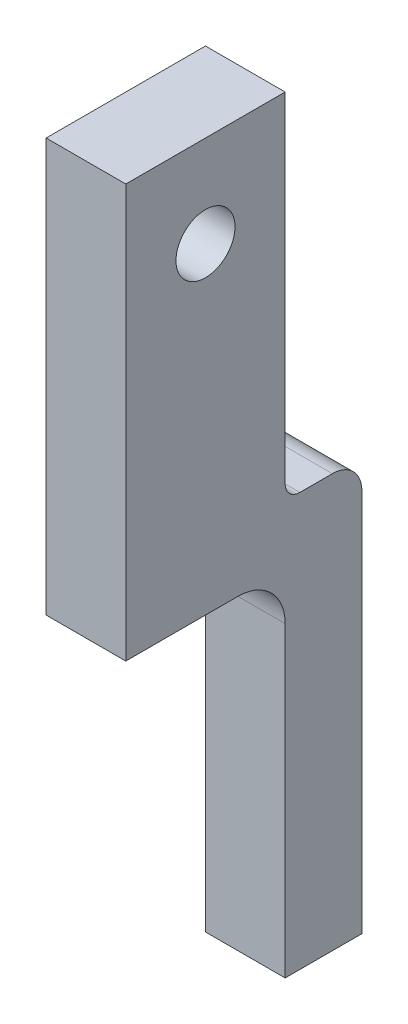
ISO-10303-21;
HEADER;
FILE_DESCRIPTION(('STEP AP214'),'2;1');
FILE_NAME('part.step','',(''),(''),'','','');
FILE_SCHEMA(('AUTOMOTIVE_DESIGN { 1 0 10303 214 1 1 1 1 }'));
ENDSEC;
DATA;
#1=APPLICATION_CONTEXT('core data for automotive mechanical design processes');
#2=APPLICATION_PROTOCOL_DEFINITION('international standard','automotive_design',2000,#1);
#3=PRODUCT_CONTEXT('',#1,'mechanical');
#4=PRODUCT('Part','Part','',(#3));
#5=PRODUCT_RELATED_PRODUCT_CATEGORY('part','',(#4));
#6=PRODUCT_DEFINITION_FORMATION('','',#4);
#7=PRODUCT_DEFINITION_CONTEXT('part definition',#1,'design');
#8=PRODUCT_DEFINITION('design','',#6,#7);
#9=PRODUCT_DEFINITION_SHAPE('','',#8);
#10=(LENGTH_UNIT() NAMED_UNIT(*) SI_UNIT(.MILLI.,.METRE.));
#11=(NAMED_UNIT(*) PLANE_ANGLE_UNIT() SI_UNIT($,.RADIAN.));
#12=(NAMED_UNIT(*) SI_UNIT($,.STERADIAN.) SOLID_ANGLE_UNIT());
#13=UNCERTAINTY_MEASURE_WITH_UNIT(LENGTH_MEASURE(1.E-05),#10,'distance_accuracy_value','');
#14=(GEOMETRIC_REPRESENTATION_CONTEXT(3) GLOBAL_UNCERTAINTY_ASSIGNED_CONTEXT((#13)) GLOBAL_UNIT_ASSIGNED_CONTEXT((#10,
#11,#12)) REPRESENTATION_CONTEXT('',''));
#15=CARTESIAN_POINT('',(0.,0.,0.));
#16=DIRECTION('',(0.,0.,1.));
#17=DIRECTION('',(1.,0.,0.));
#18=AXIS2_PLACEMENT_3D('',#15,#16,#17);
#19=CARTESIAN_POINT('',(135.,64.0392904631935,735.792131574987));
#20=DIRECTION('',(0.,0.,-1.));
#21=DIRECTION('',(0.,1.,0.));
#22=AXIS2_PLACEMENT_3D('',#19,#20,#21);
#23=PLANE('',#22);
#24=DIRECTION('',(0.,-1.,0.));
#25=VECTOR('',#24,1.);
#26=CARTESIAN_POINT('',(0.,64.0392904631935,735.792131574987));
#27=LINE('',#26,#25);
#28=CARTESIAN_POINT('',(0.,764.039290463193,735.792131574987));
#29=VERTEX_POINT('',#28);
#30=CARTESIAN_POINT('',(0.,64.0392904631935,735.792131574987));
#31=VERTEX_POINT('',#30);
#32=EDGE_CURVE('E152',#29,#31,#27,.T.);
#33=ORIENTED_EDGE('',*,*,#32,.T.);
#34=DIRECTION('',(-1.,0.,0.));
#35=VECTOR('',#34,1.);
#36=CARTESIAN_POINT('',(135.,64.0392904631935,735.792131574987));
#37=LINE('',#36,#35);
#38=CARTESIAN_POINT('',(135.,64.0392904631935,735.792131574987));
#39=VERTEX_POINT('',#38);
#40=EDGE_CURVE('E11',#39,#31,#37,.T.);
#41=ORIENTED_EDGE('',*,*,#40,.F.);
#42=DIRECTION('',(0.,-1.,0.));
#43=VECTOR('',#42,1.);
#44=CARTESIAN_POINT('',(135.,64.0392904631935,735.792131574987));
#45=LINE('',#44,#43);
#46=CARTESIAN_POINT('',(135.,764.039290463193,735.792131574987));
#47=VERTEX_POINT('',#46);
#48=EDGE_CURVE('E102',#47,#39,#45,.T.);
#49=ORIENTED_EDGE('',*,*,#48,.F.);
#50=DIRECTION('',(1.,0.,0.));
#51=VECTOR('',#50,1.);
#52=CARTESIAN_POINT('',(0.,764.039290463193,735.792131574987));
#53=LINE('',#52,#51);
#54=EDGE_CURVE('E246',#29,#47,#53,.T.);
#55=ORIENTED_EDGE('',*,*,#54,.F.);
#56=EDGE_LOOP('',(#33,#41,#49,#55));
#57=FACE_BOUND('',#56,.T.);
#58=ADVANCED_FACE('F38',(#57),#23,.F.);
#59=CARTESIAN_POINT('',(135.,64.0392904631935,545.792131574987));
#60=DIRECTION('',(0.,1.,0.));
#61=DIRECTION('',(0.,0.,1.));
#62=AXIS2_PLACEMENT_3D('',#59,#60,#61);
#63=PLANE('',#62);
#64=DIRECTION('',(0.,0.,-1.));
#65=VECTOR('',#64,1.);
#66=CARTESIAN_POINT('',(0.,64.0392904631935,545.792131574987));
#67=LINE('',#66,#65);
#68=CARTESIAN_POINT('',(0.,64.0392904631935,545.792131574987));
#69=VERTEX_POINT('',#68);
#70=EDGE_CURVE('E155',#31,#69,#67,.T.);
#71=ORIENTED_EDGE('',*,*,#70,.T.);
#72=DIRECTION('',(-1.,0.,0.));
#73=VECTOR('',#72,1.);
#74=CARTESIAN_POINT('',(135.,64.0392904631935,545.792131574987));
#75=LINE('',#74,#73);
#76=CARTESIAN_POINT('',(135.,64.0392904631935,545.792131574987));
#77=VERTEX_POINT('',#76);
#78=EDGE_CURVE('E47',#77,#69,#75,.T.);
#79=ORIENTED_EDGE('',*,*,#78,.F.);
#80=DIRECTION('',(0.,0.,-1.));
#81=VECTOR('',#80,1.);
#82=CARTESIAN_POINT('',(135.,64.0392904631935,545.792131574987));
#83=LINE('',#82,#81);
#84=EDGE_CURVE('E234',#39,#77,#83,.T.);
#85=ORIENTED_EDGE('',*,*,#84,.F.);
#86=ORIENTED_EDGE('',*,*,#40,.T.);
#87=EDGE_LOOP('',(#71,#79,#85,#86));
#88=FACE_BOUND('',#87,.T.);
#89=ADVANCED_FACE('F285',(#88),#63,.F.);
#90=CARTESIAN_POINT('',(135.,-15.9607095368065,545.792131574987));
#91=DIRECTION('',(-1.,0.,0.));
#92=DIRECTION('',(0.,0.,1.));
#93=AXIS2_PLACEMENT_3D('',#90,#91,#92);
#94=CYLINDRICAL_SURFACE('',#93,80.);
#95=CARTESIAN_POINT('',(0.,-15.9607095368065,545.792131574987));
#96=DIRECTION('',(-1.,0.,0.));
#97=DIRECTION('',(0.,0.,-1.));
#98=AXIS2_PLACEMENT_3D('',#95,#96,#97);
#99=CIRCLE('',#98,80.);
#100=CARTESIAN_POINT('',(0.,-15.9607095368065,465.792131574987));
#101=VERTEX_POINT('',#100);
#102=EDGE_CURVE('E159',#69,#101,#99,.T.);
#103=ORIENTED_EDGE('',*,*,#102,.T.);
#104=DIRECTION('',(-1.,0.,0.));
#105=VECTOR('',#104,1.);
#106=CARTESIAN_POINT('',(135.,-15.9607095368065,465.792131574987));
#107=LINE('',#106,#105);
#108=CARTESIAN_POINT('',(135.,-15.9607095368065,465.792131574987));
#109=VERTEX_POINT('',#108);
#110=EDGE_CURVE('E195',#109,#101,#107,.T.);
#111=ORIENTED_EDGE('',*,*,#110,.F.);
#112=CARTESIAN_POINT('',(135.,-15.9607095368065,545.792131574987));
#113=DIRECTION('',(-1.,0.,0.));
#114=DIRECTION('',(0.,0.,-1.));
#115=AXIS2_PLACEMENT_3D('',#112,#113,#114);
#116=CIRCLE('',#115,80.);
#117=EDGE_CURVE('E206',#77,#109,#116,.T.);
#118=ORIENTED_EDGE('',*,*,#117,.F.);
#119=ORIENTED_EDGE('',*,*,#78,.T.);
#120=EDGE_LOOP('',(#103,#111,#118,#119));
#121=FACE_BOUND('',#120,.T.);
#122=ADVANCED_FACE('F204',(#121),#94,.F.);
#123=CARTESIAN_POINT('',(135.,-535.960709536807,465.792131574987));
#124=DIRECTION('',(0.,0.,-1.));
#125=DIRECTION('',(-1.,0.,0.));
#126=AXIS2_PLACEMENT_3D('',#123,#124,#125);
#127=PLANE('',#126);
#128=DIRECTION('',(0.,-1.,0.));
#129=VECTOR('',#128,1.);
#130=CARTESIAN_POINT('',(0.,-535.960709536807,465.792131574987));
#131=LINE('',#130,#129);
#132=CARTESIAN_POINT('',(0.,-535.960709536807,465.792131574987));
#133=VERTEX_POINT('',#132);
#134=EDGE_CURVE('E162',#101,#133,#131,.T.);
#135=ORIENTED_EDGE('',*,*,#134,.T.);
#136=DIRECTION('',(-1.,0.,0.));
#137=VECTOR('',#136,1.);
#138=CARTESIAN_POINT('',(135.,-535.960709536807,465.792131574987));
#139=LINE('',#138,#137);
#140=CARTESIAN_POINT('',(135.,-535.960709536807,465.792131574987));
#141=VERTEX_POINT('',#140);
#142=EDGE_CURVE('E191',#141,#133,#139,.T.);
#143=ORIENTED_EDGE('',*,*,#142,.F.);
#144=DIRECTION('',(0.,-1.,0.));
#145=VECTOR('',#144,1.);
#146=CARTESIAN_POINT('',(135.,-535.960709536807,465.792131574987));
#147=LINE('',#146,#145);
#148=EDGE_CURVE('E226',#109,#141,#147,.T.);
#149=ORIENTED_EDGE('',*,*,#148,.F.);
#150=ORIENTED_EDGE('',*,*,#110,.T.);
#151=EDGE_LOOP('',(#135,#143,#149,#150));
#152=FACE_BOUND('',#151,.T.);
#153=ADVANCED_FACE('F218',(#152),#127,.F.);
#154=CARTESIAN_POINT('',(135.,-535.960709536807,335.792131574987));
#155=DIRECTION('',(0.,1.,0.));
#156=DIRECTION('',(0.,0.,1.));
#157=AXIS2_PLACEMENT_3D('',#154,#155,#156);
#158=PLANE('',#157);
#159=DIRECTION('',(0.,0.,-1.));
#160=VECTOR('',#159,1.);
#161=CARTESIAN_POINT('',(0.,-535.960709536807,335.792131574987));
#162=LINE('',#161,#160);
#163=CARTESIAN_POINT('',(0.,-535.960709536807,335.792131574987));
#164=VERTEX_POINT('',#163);
#165=EDGE_CURVE('E165',#133,#164,#162,.T.);
#166=ORIENTED_EDGE('',*,*,#165,.T.);
#167=DIRECTION('',(-1.,0.,0.));
#168=VECTOR('',#167,1.);
#169=CARTESIAN_POINT('',(135.,-535.960709536807,335.792131574987));
#170=LINE('',#169,#168);
#171=CARTESIAN_POINT('',(135.,-535.960709536807,335.792131574987));
#172=VERTEX_POINT('',#171);
#173=EDGE_CURVE('E187',#172,#164,#170,.T.);
#174=ORIENTED_EDGE('',*,*,#173,.F.);
#175=DIRECTION('',(0.,0.,-1.));
#176=VECTOR('',#175,1.);
#177=CARTESIAN_POINT('',(135.,-535.960709536807,335.792131574987));
#178=LINE('',#177,#176);
#179=EDGE_CURVE('E224',#141,#172,#178,.T.);
#180=ORIENTED_EDGE('',*,*,#179,.F.);
#181=ORIENTED_EDGE('',*,*,#142,.T.);
#182=EDGE_LOOP('',(#166,#174,#180,#181));
#183=FACE_BOUND('',#182,.T.);
#184=ADVANCED_FACE('F222',(#183),#158,.F.);
#185=CARTESIAN_POINT('',(135.,114.039290463193,335.792131574987));
#186=DIRECTION('',(0.,0.,1.));
#187=DIRECTION('',(0.,-1.,0.));
#188=AXIS2_PLACEMENT_3D('',#185,#186,#187);
#189=PLANE('',#188);
#190=DIRECTION('',(0.,1.,0.));
#191=VECTOR('',#190,1.);
#192=CARTESIAN_POINT('',(0.,114.039290463193,335.792131574987));
#193=LINE('',#192,#191);
#194=CARTESIAN_POINT('',(0.,114.039290463193,335.792131574987));
#195=VERTEX_POINT('',#194);
#196=EDGE_CURVE('E168',#164,#195,#193,.T.);
#197=ORIENTED_EDGE('',*,*,#196,.T.);
#198=DIRECTION('',(-1.,0.,0.));
#199=VECTOR('',#198,1.);
#200=CARTESIAN_POINT('',(135.,114.039290463193,335.792131574987));
#201=LINE('',#200,#199);
#202=CARTESIAN_POINT('',(135.,114.039290463193,335.792131574987));
#203=VERTEX_POINT('',#202);
#204=EDGE_CURVE('E138',#203,#195,#201,.T.);
#205=ORIENTED_EDGE('',*,*,#204,.F.);
#206=DIRECTION('',(0.,1.,0.));
#207=VECTOR('',#206,1.);
#208=CARTESIAN_POINT('',(135.,114.039290463193,335.792131574987));
#209=LINE('',#208,#207);
#210=EDGE_CURVE('E127',#172,#203,#209,.T.);
#211=ORIENTED_EDGE('',*,*,#210,.F.);
#212=ORIENTED_EDGE('',*,*,#173,.T.);
#213=EDGE_LOOP('',(#197,#205,#211,#212));
#214=FACE_BOUND('',#213,.T.);
#215=ADVANCED_FACE('F366',(#214),#189,.F.);
#216=CARTESIAN_POINT('',(135.,114.039290463193,385.792131574987));
#217=DIRECTION('',(-1.,0.,0.));
#218=DIRECTION('',(0.,0.,1.));
#219=AXIS2_PLACEMENT_3D('',#216,#217,#218);
#220=CYLINDRICAL_SURFACE('',#219,50.);
#221=CARTESIAN_POINT('',(0.,114.039290463193,385.792131574987));
#222=DIRECTION('',(1.,0.,0.));
#223=DIRECTION('',(0.,0.,-1.));
#224=AXIS2_PLACEMENT_3D('',#221,#222,#223);
#225=CIRCLE('',#224,50.);
#226=CARTESIAN_POINT('',(0.,164.039290463193,385.792131574987));
#227=VERTEX_POINT('',#226);
#228=EDGE_CURVE('E136',#195,#227,#225,.T.);
#229=ORIENTED_EDGE('',*,*,#228,.T.);
#230=DIRECTION('',(-1.,0.,0.));
#231=VECTOR('',#230,1.);
#232=CARTESIAN_POINT('',(135.,164.039290463193,385.792131574987));
#233=LINE('',#232,#231);
#234=CARTESIAN_POINT('',(135.,164.039290463193,385.792131574987));
#235=VERTEX_POINT('',#234);
#236=EDGE_CURVE('E133',#235,#227,#233,.T.);
#237=ORIENTED_EDGE('',*,*,#236,.F.);
#238=CARTESIAN_POINT('',(135.,114.039290463193,385.792131574987));
#239=DIRECTION('',(1.,0.,0.));
#240=DIRECTION('',(0.,0.,-1.));
#241=AXIS2_PLACEMENT_3D('',#238,#239,#240);
#242=CIRCLE('',#241,50.);
#243=EDGE_CURVE('E121',#203,#235,#242,.T.);
#244=ORIENTED_EDGE('',*,*,#243,.F.);
#245=ORIENTED_EDGE('',*,*,#204,.T.);
#246=EDGE_LOOP('',(#229,#237,#244,#245));
#247=FACE_BOUND('',#246,.T.);
#248=ADVANCED_FACE('F134',(#247),#220,.T.);
#249=CARTESIAN_POINT('',(135.,164.039290463193,440.792131574987));
#250=DIRECTION('',(0.,-1.,0.));
#251=DIRECTION('',(0.,0.,-1.));
#252=AXIS2_PLACEMENT_3D('',#249,#250,#251);
#253=PLANE('',#252);
#254=DIRECTION('',(0.,0.,1.));
#255=VECTOR('',#254,1.);
#256=CARTESIAN_POINT('',(0.,164.039290463193,440.792131574987));
#257=LINE('',#256,#255);
#258=CARTESIAN_POINT('',(0.,164.039290463193,440.792131574987));
#259=VERTEX_POINT('',#258);
#260=EDGE_CURVE('E88',#227,#259,#257,.T.);
#261=ORIENTED_EDGE('',*,*,#260,.T.);
#262=DIRECTION('',(-1.,0.,0.));
#263=VECTOR('',#262,1.);
#264=CARTESIAN_POINT('',(135.,164.039290463193,440.792131574987));
#265=LINE('',#264,#263);
#266=CARTESIAN_POINT('',(135.,164.039290463193,440.792131574987));
#267=VERTEX_POINT('',#266);
#268=EDGE_CURVE('E139',#267,#259,#265,.T.);
#269=ORIENTED_EDGE('',*,*,#268,.F.);
#270=DIRECTION('',(0.,0.,1.));
#271=VECTOR('',#270,1.);
#272=CARTESIAN_POINT('',(135.,164.039290463193,440.792131574987));
#273=LINE('',#272,#271);
#274=EDGE_CURVE('E125',#235,#267,#273,.T.);
#275=ORIENTED_EDGE('',*,*,#274,.F.);
#276=ORIENTED_EDGE('',*,*,#236,.T.);
#277=EDGE_LOOP('',(#261,#269,#275,#276));
#278=FACE_BOUND('',#277,.T.);
#279=ADVANCED_FACE('F141',(#278),#253,.F.);
#280=CARTESIAN_POINT('',(135.,189.039290463193,440.792131574987));
#281=DIRECTION('',(-1.,0.,0.));
#282=DIRECTION('',(0.,0.,1.));
#283=AXIS2_PLACEMENT_3D('',#280,#281,#282);
#284=CYLINDRICAL_SURFACE('',#283,25.);
#285=CARTESIAN_POINT('',(0.,189.039290463193,440.792131574987));
#286=DIRECTION('',(-1.,0.,0.));
#287=DIRECTION('',(0.,0.,1.));
#288=AXIS2_PLACEMENT_3D('',#285,#286,#287);
#289=CIRCLE('',#288,25.);
#290=CARTESIAN_POINT('',(0.,189.039290463193,465.792131574987));
#291=VERTEX_POINT('',#290);
#292=EDGE_CURVE('E94',#259,#291,#289,.T.);
#293=ORIENTED_EDGE('',*,*,#292,.T.);
#294=DIRECTION('',(-1.,0.,0.));
#295=VECTOR('',#294,1.);
#296=CARTESIAN_POINT('',(135.,189.039290463193,465.792131574987));
#297=LINE('',#296,#295);
#298=CARTESIAN_POINT('',(135.,189.039290463193,465.792131574987));
#299=VERTEX_POINT('',#298);
#300=EDGE_CURVE('E151',#299,#291,#297,.T.);
#301=ORIENTED_EDGE('',*,*,#300,.F.);
#302=CARTESIAN_POINT('',(135.,189.039290463193,440.792131574987));
#303=DIRECTION('',(-1.,0.,0.));
#304=DIRECTION('',(0.,0.,1.));
#305=AXIS2_PLACEMENT_3D('',#302,#303,#304);
#306=CIRCLE('',#305,25.);
#307=EDGE_CURVE('E55',#267,#299,#306,.T.);
#308=ORIENTED_EDGE('',*,*,#307,.F.);
#309=ORIENTED_EDGE('',*,*,#268,.T.);
#310=EDGE_LOOP('',(#293,#301,#308,#309));
#311=FACE_BOUND('',#310,.T.);
#312=ADVANCED_FACE('F280',(#311),#284,.F.);
#313=CARTESIAN_POINT('',(135.,464.039290463193,465.792131574987));
#314=DIRECTION('',(0.,0.,1.));
#315=DIRECTION('',(0.,-1.,0.));
#316=AXIS2_PLACEMENT_3D('',#313,#314,#315);
#317=PLANE('',#316);
#318=DIRECTION('',(0.,1.,0.));
#319=VECTOR('',#318,1.);
#320=CARTESIAN_POINT('',(0.,464.039290463193,465.792131574987));
#321=LINE('',#320,#319);
#322=CARTESIAN_POINT('',(0.,764.039290463193,465.792131574987));
#323=VERTEX_POINT('',#322);
#324=EDGE_CURVE('E177',#291,#323,#321,.T.);
#325=ORIENTED_EDGE('',*,*,#324,.T.);
#326=DIRECTION('',(-1.,0.,0.));
#327=VECTOR('',#326,1.);
#328=CARTESIAN_POINT('',(0.,764.039290463193,465.792131574987));
#329=LINE('',#328,#327);
#330=CARTESIAN_POINT('',(135.,764.039290463193,465.792131574987));
#331=VERTEX_POINT('',#330);
#332=EDGE_CURVE('E156',#331,#323,#329,.T.);
#333=ORIENTED_EDGE('',*,*,#332,.F.);
#334=DIRECTION('',(0.,1.,0.));
#335=VECTOR('',#334,1.);
#336=CARTESIAN_POINT('',(135.,464.039290463193,465.792131574987));
#337=LINE('',#336,#335);
#338=EDGE_CURVE('E145',#299,#331,#337,.T.);
#339=ORIENTED_EDGE('',*,*,#338,.F.);
#340=ORIENTED_EDGE('',*,*,#300,.T.);
#341=EDGE_LOOP('',(#325,#333,#339,#340));
#342=FACE_BOUND('',#341,.T.);
#343=ADVANCED_FACE('F272',(#342),#317,.F.);
#344=CARTESIAN_POINT('',(135.,189.039290463193,440.792131574987));
#345=DIRECTION('',(-1.,0.,0.));
#346=DIRECTION('',(0.,0.,1.));
#347=AXIS2_PLACEMENT_3D('',#344,#345,#346);
#348=PLANE('',#347);
#349=CARTESIAN_POINT('',(135.,609.039290463193,600.792131574987));
#350=DIRECTION('',(1.,0.,0.));
#351=DIRECTION('',(0.,0.,-1.));
#352=AXIS2_PLACEMENT_3D('',#349,#350,#351);
#353=CIRCLE('',#352,50.);
#354=CARTESIAN_POINT('',(135.,609.039290463193,550.792131574987));
#355=VERTEX_POINT('',#354);
#356=EDGE_CURVE('E255',#355,#355,#353,.T.);
#357=ORIENTED_EDGE('',*,*,#356,.F.);
#358=EDGE_LOOP('',(#357));
#359=FACE_BOUND('',#358,.T.);
#360=ORIENTED_EDGE('',*,*,#338,.T.);
#361=DIRECTION('',(0.,0.,-1.));
#362=VECTOR('',#361,1.);
#363=CARTESIAN_POINT('',(135.,764.039290463193,465.792131574987));
#364=LINE('',#363,#362);
#365=EDGE_CURVE('E242',#47,#331,#364,.T.);
#366=ORIENTED_EDGE('',*,*,#365,.F.);
#367=ORIENTED_EDGE('',*,*,#48,.T.);
#368=ORIENTED_EDGE('',*,*,#84,.T.);
#369=ORIENTED_EDGE('',*,*,#117,.T.);
#370=ORIENTED_EDGE('',*,*,#148,.T.);
#371=ORIENTED_EDGE('',*,*,#179,.T.);
#372=ORIENTED_EDGE('',*,*,#210,.T.);
#373=ORIENTED_EDGE('',*,*,#243,.T.);
#374=ORIENTED_EDGE('',*,*,#274,.T.);
#375=ORIENTED_EDGE('',*,*,#307,.T.);
#376=EDGE_LOOP('',(#360,#366,#367,#368,#369,#370,#371,#372,#373,#374,#375));
#377=FACE_BOUND('',#376,.T.);
#378=ADVANCED_FACE('F123',(#359,#377),#348,.F.);
#379=CARTESIAN_POINT('',(0.,189.039290463193,440.792131574987));
#380=DIRECTION('',(-1.,0.,0.));
#381=DIRECTION('',(0.,0.,1.));
#382=AXIS2_PLACEMENT_3D('',#379,#380,#381);
#383=PLANE('',#382);
#384=CARTESIAN_POINT('',(0.,609.039290463193,600.792131574987));
#385=DIRECTION('',(1.,0.,0.));
#386=DIRECTION('',(0.,0.,-1.));
#387=AXIS2_PLACEMENT_3D('',#384,#385,#386);
#388=CIRCLE('',#387,50.);
#389=CARTESIAN_POINT('',(0.,609.039290463193,550.792131574987));
#390=VERTEX_POINT('',#389);
#391=EDGE_CURVE('E254',#390,#390,#388,.T.);
#392=ORIENTED_EDGE('',*,*,#391,.T.);
#393=EDGE_LOOP('',(#392));
#394=FACE_BOUND('',#393,.T.);
#395=ORIENTED_EDGE('',*,*,#32,.F.);
#396=DIRECTION('',(0.,0.,1.));
#397=VECTOR('',#396,1.);
#398=CARTESIAN_POINT('',(0.,764.039290463193,465.792131574987));
#399=LINE('',#398,#397);
#400=EDGE_CURVE('E250',#323,#29,#399,.T.);
#401=ORIENTED_EDGE('',*,*,#400,.F.);
#402=ORIENTED_EDGE('',*,*,#324,.F.);
#403=ORIENTED_EDGE('',*,*,#292,.F.);
#404=ORIENTED_EDGE('',*,*,#260,.F.);
#405=ORIENTED_EDGE('',*,*,#228,.F.);
#406=ORIENTED_EDGE('',*,*,#196,.F.);
#407=ORIENTED_EDGE('',*,*,#165,.F.);
#408=ORIENTED_EDGE('',*,*,#134,.F.);
#409=ORIENTED_EDGE('',*,*,#102,.F.);
#410=ORIENTED_EDGE('',*,*,#70,.F.);
#411=EDGE_LOOP('',(#395,#401,#402,#403,#404,#405,#406,#407,#408,#409,#410));
#412=FACE_BOUND('',#411,.T.);
#413=ADVANCED_FACE('F213',(#394,#412),#383,.T.);
#414=CARTESIAN_POINT('',(0.,764.039290463193,0.));
#415=DIRECTION('',(0.,1.,0.));
#416=DIRECTION('',(0.,0.,1.));
#417=AXIS2_PLACEMENT_3D('',#414,#415,#416);
#418=PLANE('',#417);
#419=ORIENTED_EDGE('',*,*,#400,.T.);
#420=ORIENTED_EDGE('',*,*,#54,.T.);
#421=ORIENTED_EDGE('',*,*,#365,.T.);
#422=ORIENTED_EDGE('',*,*,#332,.T.);
#423=EDGE_LOOP('',(#419,#420,#421,#422));
#424=FACE_BOUND('',#423,.T.);
#425=ADVANCED_FACE('F267',(#424),#418,.T.);
#426=CARTESIAN_POINT('',(0.,609.039290463193,600.792131574987));
#427=DIRECTION('',(1.,0.,0.));
#428=DIRECTION('',(0.,0.,-1.));
#429=AXIS2_PLACEMENT_3D('',#426,#427,#428);
#430=CYLINDRICAL_SURFACE('',#429,50.);
#431=ORIENTED_EDGE('',*,*,#391,.F.);
#432=EDGE_LOOP('',(#431));
#433=FACE_BOUND('',#432,.T.);
#434=ORIENTED_EDGE('',*,*,#356,.T.);
#435=EDGE_LOOP('',(#434));
#436=FACE_BOUND('',#435,.T.);
#437=ADVANCED_FACE('F264',(#433,#436),#430,.F.);
#438=CLOSED_SHELL('',(#58,#89,#122,#153,#184,#215,#248,#279,#312,#343,#378,#413,#425,#437));
#439=MANIFOLD_SOLID_BREP('B2',#438);
#440=ADVANCED_BREP_SHAPE_REPRESENTATION('',(#18,#439),#14);
#441=SHAPE_DEFINITION_REPRESENTATION(#9,#440);
ENDSEC;
END-ISO-10303-21;
